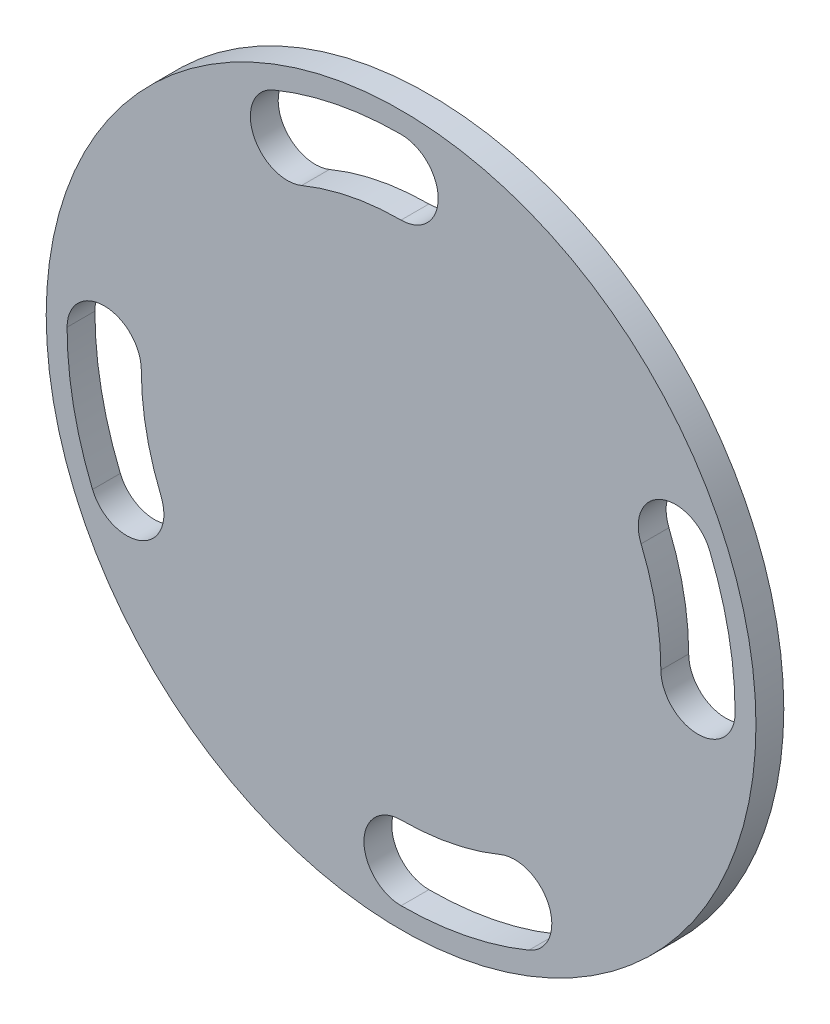
ISO-10303-21;
HEADER;
FILE_DESCRIPTION(('STEP AP214'),'2;1');
FILE_NAME('part.step','',(''),(''),'','','');
FILE_SCHEMA(('AUTOMOTIVE_DESIGN { 1 0 10303 214 1 1 1 1 }'));
ENDSEC;
DATA;
#1=APPLICATION_CONTEXT('core data for automotive mechanical design processes');
#2=APPLICATION_PROTOCOL_DEFINITION('international standard','automotive_design',2000,#1);
#3=PRODUCT_CONTEXT('',#1,'mechanical');
#4=PRODUCT('Part','Part','',(#3));
#5=PRODUCT_RELATED_PRODUCT_CATEGORY('part','',(#4));
#6=PRODUCT_DEFINITION_FORMATION('','',#4);
#7=PRODUCT_DEFINITION_CONTEXT('part definition',#1,'design');
#8=PRODUCT_DEFINITION('design','',#6,#7);
#9=PRODUCT_DEFINITION_SHAPE('','',#8);
#10=(LENGTH_UNIT() NAMED_UNIT(*) SI_UNIT(.MILLI.,.METRE.));
#11=(NAMED_UNIT(*) PLANE_ANGLE_UNIT() SI_UNIT($,.RADIAN.));
#12=(NAMED_UNIT(*) SI_UNIT($,.STERADIAN.) SOLID_ANGLE_UNIT());
#13=UNCERTAINTY_MEASURE_WITH_UNIT(LENGTH_MEASURE(1.E-05),#10,'distance_accuracy_value','');
#14=(GEOMETRIC_REPRESENTATION_CONTEXT(3) GLOBAL_UNCERTAINTY_ASSIGNED_CONTEXT((#13)) GLOBAL_UNIT_ASSIGNED_CONTEXT((#10,
#11,#12)) REPRESENTATION_CONTEXT('',''));
#15=CARTESIAN_POINT('',(0.,0.,0.));
#16=DIRECTION('',(0.,0.,1.));
#17=DIRECTION('',(1.,0.,0.));
#18=AXIS2_PLACEMENT_3D('',#15,#16,#17);
#19=CARTESIAN_POINT('',(0.,0.,0.6));
#20=DIRECTION('',(0.,0.,1.));
#21=DIRECTION('',(1.,0.,0.));
#22=AXIS2_PLACEMENT_3D('',#19,#20,#21);
#23=PLANE('',#22);
#24=CARTESIAN_POINT('',(0.,0.,0.6));
#25=DIRECTION('',(0.,0.,1.));
#26=DIRECTION('',(1.,0.,0.));
#27=AXIS2_PLACEMENT_3D('',#24,#25,#26);
#28=CIRCLE('',#27,7.65);
#29=CARTESIAN_POINT('',(7.65,0.,0.6));
#30=VERTEX_POINT('',#29);
#31=EDGE_CURVE('E11',#30,#30,#28,.T.);
#32=ORIENTED_EDGE('',*,*,#31,.T.);
#33=EDGE_LOOP('',(#32));
#34=FACE_BOUND('',#33,.T.);
#35=CARTESIAN_POINT('',(0.,6.4,0.6));
#36=DIRECTION('',(0.,0.,1.));
#37=DIRECTION('',(1.,0.,0.));
#38=AXIS2_PLACEMENT_3D('',#35,#36,#37);
#39=CIRCLE('',#38,0.800000000000025);
#40=CARTESIAN_POINT('',(0.,5.59999999999997,0.6));
#41=VERTEX_POINT('',#40);
#42=CARTESIAN_POINT('',(0.,7.20000000000064,0.6));
#43=VERTEX_POINT('',#42);
#44=EDGE_CURVE('E249',#41,#43,#39,.T.);
#45=ORIENTED_EDGE('',*,*,#44,.F.);
#46=CARTESIAN_POINT('',(0.,0.,0.6));
#47=DIRECTION('',(0.,0.,-1.));
#48=DIRECTION('',(1.,0.,0.));
#49=AXIS2_PLACEMENT_3D('',#46,#47,#48);
#50=CIRCLE('',#49,5.60000000000057);
#51=CARTESIAN_POINT('',(-2.14302722124451,5.173725382063,0.6));
#52=VERTEX_POINT('',#51);
#53=EDGE_CURVE('E247',#52,#41,#50,.T.);
#54=ORIENTED_EDGE('',*,*,#53,.F.);
#55=CARTESIAN_POINT('',(-2.44917396713655,5.9128290080721,0.6));
#56=DIRECTION('',(0.,0.,1.));
#57=DIRECTION('',(1.,0.,0.));
#58=AXIS2_PLACEMENT_3D('',#55,#56,#57);
#59=CIRCLE('',#58,0.800000000000046);
#60=CARTESIAN_POINT('',(-2.75532071302869,6.65193263408115,0.6));
#61=VERTEX_POINT('',#60);
#62=EDGE_CURVE('E255',#61,#52,#59,.T.);
#63=ORIENTED_EDGE('',*,*,#62,.F.);
#64=CARTESIAN_POINT('',(0.,0.,0.6));
#65=DIRECTION('',(0.,0.,1.));
#66=DIRECTION('',(1.,0.,0.));
#67=AXIS2_PLACEMENT_3D('',#64,#65,#66);
#68=CIRCLE('',#67,7.20000000000064);
#69=EDGE_CURVE('E252',#43,#61,#68,.T.);
#70=ORIENTED_EDGE('',*,*,#69,.F.);
#71=EDGE_LOOP('',(#45,#54,#63,#70));
#72=FACE_BOUND('',#71,.T.);
#73=CARTESIAN_POINT('',(5.91282900807269,2.44917396713695,0.6));
#74=DIRECTION('',(0.,0.,1.));
#75=DIRECTION('',(1.,0.,0.));
#76=AXIS2_PLACEMENT_3D('',#73,#74,#75);
#77=CIRCLE('',#76,0.800000000000009);
#78=CARTESIAN_POINT('',(6.65193263408171,2.75532071302906,0.6));
#79=VERTEX_POINT('',#78);
#80=CARTESIAN_POINT('',(5.17372538206366,2.14302722124487,0.6));
#81=VERTEX_POINT('',#80);
#82=EDGE_CURVE('E218',#79,#81,#77,.T.);
#83=ORIENTED_EDGE('',*,*,#82,.F.);
#84=CARTESIAN_POINT('',(0.,0.,0.6));
#85=DIRECTION('',(0.,0.,1.));
#86=DIRECTION('',(1.,0.,0.));
#87=AXIS2_PLACEMENT_3D('',#84,#85,#86);
#88=CIRCLE('',#87,7.20000000000066);
#89=CARTESIAN_POINT('',(7.20000000000066,3.58609509207387E-13,0.6));
#90=VERTEX_POINT('',#89);
#91=EDGE_CURVE('E216',#90,#79,#88,.T.);
#92=ORIENTED_EDGE('',*,*,#91,.F.);
#93=CARTESIAN_POINT('',(6.40000000000056,3.58609509207387E-13,0.6));
#94=DIRECTION('',(0.,0.,1.));
#95=DIRECTION('',(1.,0.,0.));
#96=AXIS2_PLACEMENT_3D('',#93,#94,#95);
#97=CIRCLE('',#96,0.800000000000101);
#98=CARTESIAN_POINT('',(5.60000000000046,3.13783320556462E-13,0.6));
#99=VERTEX_POINT('',#98);
#100=EDGE_CURVE('E224',#99,#90,#97,.T.);
#101=ORIENTED_EDGE('',*,*,#100,.F.);
#102=CARTESIAN_POINT('',(0.,0.,0.6));
#103=DIRECTION('',(0.,0.,-1.));
#104=DIRECTION('',(1.,0.,0.));
#105=AXIS2_PLACEMENT_3D('',#102,#103,#104);
#106=CIRCLE('',#105,5.60000000000055);
#107=EDGE_CURVE('E221',#81,#99,#106,.T.);
#108=ORIENTED_EDGE('',*,*,#107,.F.);
#109=EDGE_LOOP('',(#83,#92,#101,#108));
#110=FACE_BOUND('',#109,.T.);
#111=CARTESIAN_POINT('',(-5.91282900807169,-2.44917396713714,0.6));
#112=DIRECTION('',(0.,0.,1.));
#113=DIRECTION('',(1.,0.,0.));
#114=AXIS2_PLACEMENT_3D('',#111,#112,#113);
#115=CIRCLE('',#114,0.800000000000163);
#116=CARTESIAN_POINT('',(-6.65193263408079,-2.75532071302948,0.6));
#117=VERTEX_POINT('',#116);
#118=CARTESIAN_POINT('',(-5.17372538206338,-2.14302722124526,0.6));
#119=VERTEX_POINT('',#118);
#120=EDGE_CURVE('E187',#117,#119,#115,.T.);
#121=ORIENTED_EDGE('',*,*,#120,.F.);
#122=CARTESIAN_POINT('',(0.,0.,0.6));
#123=DIRECTION('',(0.,0.,1.));
#124=DIRECTION('',(1.,0.,0.));
#125=AXIS2_PLACEMENT_3D('',#122,#123,#124);
#126=CIRCLE('',#125,7.20000000000072);
#127=CARTESIAN_POINT('',(-7.19999999999976,-6.28046998985927E-13,0.6));
#128=VERTEX_POINT('',#127);
#129=EDGE_CURVE('E185',#128,#117,#126,.T.);
#130=ORIENTED_EDGE('',*,*,#129,.F.);
#131=CARTESIAN_POINT('',(-6.39999999999964,-5.5851178262536E-13,0.6));
#132=DIRECTION('',(0.,0.,1.));
#133=DIRECTION('',(1.,0.,0.));
#134=AXIS2_PLACEMENT_3D('',#131,#132,#133);
#135=CIRCLE('',#134,0.800000000000114);
#136=CARTESIAN_POINT('',(-5.59999999999953,-5.5851178262536E-13,0.6));
#137=VERTEX_POINT('',#136);
#138=EDGE_CURVE('E193',#137,#128,#135,.T.);
#139=ORIENTED_EDGE('',*,*,#138,.F.);
#140=CARTESIAN_POINT('',(0.,0.,0.6));
#141=DIRECTION('',(0.,0.,-1.));
#142=DIRECTION('',(1.,0.,0.));
#143=AXIS2_PLACEMENT_3D('',#140,#141,#142);
#144=CIRCLE('',#143,5.60000000000045);
#145=EDGE_CURVE('E190',#119,#137,#144,.T.);
#146=ORIENTED_EDGE('',*,*,#145,.F.);
#147=EDGE_LOOP('',(#121,#130,#139,#146));
#148=FACE_BOUND('',#147,.T.);
#149=CARTESIAN_POINT('',(9.15962817610477E-13,-6.4000000000002,0.6));
#150=DIRECTION('',(0.,0.,1.));
#151=DIRECTION('',(1.,0.,0.));
#152=AXIS2_PLACEMENT_3D('',#149,#150,#151);
#153=CIRCLE('',#152,0.800000000000045);
#154=CARTESIAN_POINT('',(8.01436787341121E-13,-5.60000000000016,0.6));
#155=VERTEX_POINT('',#154);
#156=CARTESIAN_POINT('',(1.03021324045196E-12,-7.20000000000024,0.6));
#157=VERTEX_POINT('',#156);
#158=EDGE_CURVE('E157',#155,#157,#153,.T.);
#159=ORIENTED_EDGE('',*,*,#158,.F.);
#160=CARTESIAN_POINT('',(0.,0.,0.6));
#161=DIRECTION('',(0.,0.,-1.));
#162=DIRECTION('',(1.,0.,0.));
#163=AXIS2_PLACEMENT_3D('',#160,#161,#162);
#164=CIRCLE('',#163,5.60000000000052);
#165=CARTESIAN_POINT('',(2.14302722124531,-5.17372538206324,0.6));
#166=VERTEX_POINT('',#165);
#167=EDGE_CURVE('E149',#166,#155,#164,.T.);
#168=ORIENTED_EDGE('',*,*,#167,.F.);
#169=CARTESIAN_POINT('',(2.44917396713749,-5.91282900807225,0.6));
#170=DIRECTION('',(0.,0.,1.));
#171=DIRECTION('',(1.,0.,0.));
#172=AXIS2_PLACEMENT_3D('',#169,#170,#171);
#173=CIRCLE('',#172,0.800000000000027);
#174=CARTESIAN_POINT('',(2.75532071302967,-6.65193263408127,0.6));
#175=VERTEX_POINT('',#174);
#176=EDGE_CURVE('E171',#175,#166,#173,.T.);
#177=ORIENTED_EDGE('',*,*,#176,.F.);
#178=CARTESIAN_POINT('',(0.,0.,0.6));
#179=DIRECTION('',(0.,0.,1.));
#180=DIRECTION('',(1.,0.,0.));
#181=AXIS2_PLACEMENT_3D('',#178,#179,#180);
#182=CIRCLE('',#181,7.20000000000059);
#183=EDGE_CURVE('E169',#157,#175,#182,.T.);
#184=ORIENTED_EDGE('',*,*,#183,.F.);
#185=EDGE_LOOP('',(#159,#168,#177,#184));
#186=FACE_BOUND('',#185,.T.);
#187=ADVANCED_FACE('F36',(#34,#72,#110,#148,#186),#23,.T.);
#188=CARTESIAN_POINT('',(0.,0.,0.));
#189=DIRECTION('',(0.,0.,1.));
#190=DIRECTION('',(1.,0.,0.));
#191=AXIS2_PLACEMENT_3D('',#188,#189,#190);
#192=PLANE('',#191);
#193=CARTESIAN_POINT('',(0.,0.,0.));
#194=DIRECTION('',(0.,0.,1.));
#195=DIRECTION('',(1.,0.,0.));
#196=AXIS2_PLACEMENT_3D('',#193,#194,#195);
#197=CIRCLE('',#196,7.20000000000072);
#198=CARTESIAN_POINT('',(-7.19999999999976,-6.28046998985927E-13,0.));
#199=VERTEX_POINT('',#198);
#200=CARTESIAN_POINT('',(-6.65193263408079,-2.75532071302948,0.));
#201=VERTEX_POINT('',#200);
#202=EDGE_CURVE('E165',#199,#201,#197,.T.);
#203=ORIENTED_EDGE('',*,*,#202,.T.);
#204=CARTESIAN_POINT('',(-5.91282900807169,-2.44917396713714,0.));
#205=DIRECTION('',(0.,0.,1.));
#206=DIRECTION('',(1.,0.,0.));
#207=AXIS2_PLACEMENT_3D('',#204,#205,#206);
#208=CIRCLE('',#207,0.800000000000163);
#209=CARTESIAN_POINT('',(-5.17372538206338,-2.14302722124526,0.));
#210=VERTEX_POINT('',#209);
#211=EDGE_CURVE('E198',#201,#210,#208,.T.);
#212=ORIENTED_EDGE('',*,*,#211,.T.);
#213=CARTESIAN_POINT('',(0.,0.,0.));
#214=DIRECTION('',(0.,0.,-1.));
#215=DIRECTION('',(1.,0.,0.));
#216=AXIS2_PLACEMENT_3D('',#213,#214,#215);
#217=CIRCLE('',#216,5.60000000000045);
#218=CARTESIAN_POINT('',(-5.59999999999953,-4.88697809797176E-13,0.));
#219=VERTEX_POINT('',#218);
#220=EDGE_CURVE('E201',#210,#219,#217,.T.);
#221=ORIENTED_EDGE('',*,*,#220,.T.);
#222=CARTESIAN_POINT('',(-6.39999999999964,-5.5851178262536E-13,0.));
#223=DIRECTION('',(0.,0.,1.));
#224=DIRECTION('',(1.,0.,0.));
#225=AXIS2_PLACEMENT_3D('',#222,#223,#224);
#226=CIRCLE('',#225,0.800000000000114);
#227=EDGE_CURVE('E188',#219,#199,#226,.T.);
#228=ORIENTED_EDGE('',*,*,#227,.T.);
#229=EDGE_LOOP('',(#203,#212,#221,#228));
#230=FACE_BOUND('',#229,.T.);
#231=CARTESIAN_POINT('',(0.,0.,0.));
#232=DIRECTION('',(0.,0.,-1.));
#233=DIRECTION('',(1.,0.,0.));
#234=AXIS2_PLACEMENT_3D('',#231,#232,#233);
#235=CIRCLE('',#234,5.60000000000057);
#236=CARTESIAN_POINT('',(-2.14302722124451,5.173725382063,0.));
#237=VERTEX_POINT('',#236);
#238=CARTESIAN_POINT('',(0.,5.59999999999997,0.));
#239=VERTEX_POINT('',#238);
#240=EDGE_CURVE('E246',#237,#239,#235,.T.);
#241=ORIENTED_EDGE('',*,*,#240,.T.);
#242=CARTESIAN_POINT('',(0.,6.4,0.));
#243=DIRECTION('',(0.,0.,1.));
#244=DIRECTION('',(1.,0.,0.));
#245=AXIS2_PLACEMENT_3D('',#242,#243,#244);
#246=CIRCLE('',#245,0.800000000000025);
#247=CARTESIAN_POINT('',(0.,7.20000000000064,0.));
#248=VERTEX_POINT('',#247);
#249=EDGE_CURVE('E260',#239,#248,#246,.T.);
#250=ORIENTED_EDGE('',*,*,#249,.T.);
#251=CARTESIAN_POINT('',(0.,0.,0.));
#252=DIRECTION('',(0.,0.,1.));
#253=DIRECTION('',(1.,0.,0.));
#254=AXIS2_PLACEMENT_3D('',#251,#252,#253);
#255=CIRCLE('',#254,7.20000000000064);
#256=CARTESIAN_POINT('',(-2.75532071302869,6.65193263408115,0.));
#257=VERTEX_POINT('',#256);
#258=EDGE_CURVE('E263',#248,#257,#255,.T.);
#259=ORIENTED_EDGE('',*,*,#258,.T.);
#260=CARTESIAN_POINT('',(-2.44917396713655,5.9128290080721,0.));
#261=DIRECTION('',(0.,0.,1.));
#262=DIRECTION('',(1.,0.,0.));
#263=AXIS2_PLACEMENT_3D('',#260,#261,#262);
#264=CIRCLE('',#263,0.800000000000046);
#265=EDGE_CURVE('E250',#257,#237,#264,.T.);
#266=ORIENTED_EDGE('',*,*,#265,.T.);
#267=EDGE_LOOP('',(#241,#250,#259,#266));
#268=FACE_BOUND('',#267,.T.);
#269=CARTESIAN_POINT('',(0.,0.,0.));
#270=DIRECTION('',(0.,0.,1.));
#271=DIRECTION('',(1.,0.,0.));
#272=AXIS2_PLACEMENT_3D('',#269,#270,#271);
#273=CIRCLE('',#272,7.65);
#274=CARTESIAN_POINT('',(7.65,0.,0.));
#275=VERTEX_POINT('',#274);
#276=EDGE_CURVE('E40',#275,#275,#273,.T.);
#277=ORIENTED_EDGE('',*,*,#276,.F.);
#278=EDGE_LOOP('',(#277));
#279=FACE_BOUND('',#278,.T.);
#280=CARTESIAN_POINT('',(0.,0.,0.));
#281=DIRECTION('',(0.,0.,1.));
#282=DIRECTION('',(1.,0.,0.));
#283=AXIS2_PLACEMENT_3D('',#280,#281,#282);
#284=CIRCLE('',#283,7.20000000000066);
#285=CARTESIAN_POINT('',(7.20000000000066,3.58609509207387E-13,0.));
#286=VERTEX_POINT('',#285);
#287=CARTESIAN_POINT('',(6.65193263408171,2.75532071302906,0.));
#288=VERTEX_POINT('',#287);
#289=EDGE_CURVE('E215',#286,#288,#284,.T.);
#290=ORIENTED_EDGE('',*,*,#289,.T.);
#291=CARTESIAN_POINT('',(5.91282900807269,2.44917396713695,0.));
#292=DIRECTION('',(0.,0.,1.));
#293=DIRECTION('',(1.,0.,0.));
#294=AXIS2_PLACEMENT_3D('',#291,#292,#293);
#295=CIRCLE('',#294,0.800000000000009);
#296=CARTESIAN_POINT('',(5.17372538206366,2.14302722124487,0.));
#297=VERTEX_POINT('',#296);
#298=EDGE_CURVE('E229',#288,#297,#295,.T.);
#299=ORIENTED_EDGE('',*,*,#298,.T.);
#300=CARTESIAN_POINT('',(0.,0.,0.));
#301=DIRECTION('',(0.,0.,-1.));
#302=DIRECTION('',(1.,0.,0.));
#303=AXIS2_PLACEMENT_3D('',#300,#301,#302);
#304=CIRCLE('',#303,5.60000000000055);
#305=CARTESIAN_POINT('',(5.60000000000055,3.13783320556467E-13,0.));
#306=VERTEX_POINT('',#305);
#307=EDGE_CURVE('E232',#297,#306,#304,.T.);
#308=ORIENTED_EDGE('',*,*,#307,.T.);
#309=CARTESIAN_POINT('',(6.40000000000056,3.58609509207387E-13,0.));
#310=DIRECTION('',(0.,0.,1.));
#311=DIRECTION('',(1.,0.,0.));
#312=AXIS2_PLACEMENT_3D('',#309,#310,#311);
#313=CIRCLE('',#312,0.800000000000101);
#314=EDGE_CURVE('E219',#306,#286,#313,.T.);
#315=ORIENTED_EDGE('',*,*,#314,.T.);
#316=EDGE_LOOP('',(#290,#299,#308,#315));
#317=FACE_BOUND('',#316,.T.);
#318=CARTESIAN_POINT('',(0.,0.,0.));
#319=DIRECTION('',(0.,0.,-1.));
#320=DIRECTION('',(1.,0.,0.));
#321=AXIS2_PLACEMENT_3D('',#318,#319,#320);
#322=CIRCLE('',#321,5.60000000000052);
#323=CARTESIAN_POINT('',(2.14302722124531,-5.17372538206324,0.));
#324=VERTEX_POINT('',#323);
#325=CARTESIAN_POINT('',(8.01436787341121E-13,-5.60000000000016,0.));
#326=VERTEX_POINT('',#325);
#327=EDGE_CURVE('E59',#324,#326,#322,.T.);
#328=ORIENTED_EDGE('',*,*,#327,.T.);
#329=CARTESIAN_POINT('',(9.15962817610477E-13,-6.4000000000002,0.));
#330=DIRECTION('',(0.,0.,1.));
#331=DIRECTION('',(1.,0.,0.));
#332=AXIS2_PLACEMENT_3D('',#329,#330,#331);
#333=CIRCLE('',#332,0.800000000000045);
#334=CARTESIAN_POINT('',(1.03021324045196E-12,-7.20000000000024,0.));
#335=VERTEX_POINT('',#334);
#336=EDGE_CURVE('E164',#326,#335,#333,.T.);
#337=ORIENTED_EDGE('',*,*,#336,.T.);
#338=CARTESIAN_POINT('',(0.,0.,0.));
#339=DIRECTION('',(0.,0.,1.));
#340=DIRECTION('',(1.,0.,0.));
#341=AXIS2_PLACEMENT_3D('',#338,#339,#340);
#342=CIRCLE('',#341,7.20000000000059);
#343=CARTESIAN_POINT('',(2.75532071302975,-6.65193263408145,0.));
#344=VERTEX_POINT('',#343);
#345=EDGE_CURVE('E177',#335,#344,#342,.T.);
#346=ORIENTED_EDGE('',*,*,#345,.T.);
#347=CARTESIAN_POINT('',(2.44917396713749,-5.91282900807225,0.));
#348=DIRECTION('',(0.,0.,1.));
#349=DIRECTION('',(1.,0.,0.));
#350=AXIS2_PLACEMENT_3D('',#347,#348,#349);
#351=CIRCLE('',#350,0.800000000000027);
#352=EDGE_CURVE('E158',#344,#324,#351,.T.);
#353=ORIENTED_EDGE('',*,*,#352,.T.);
#354=EDGE_LOOP('',(#328,#337,#346,#353));
#355=FACE_BOUND('',#354,.T.);
#356=ADVANCED_FACE('F282',(#230,#268,#279,#317,#355),#192,.F.);
#357=CARTESIAN_POINT('',(0.,0.,0.6));
#358=DIRECTION('',(0.,0.,-1.));
#359=DIRECTION('',(-1.,0.,0.));
#360=AXIS2_PLACEMENT_3D('',#357,#358,#359);
#361=CYLINDRICAL_SURFACE('',#360,7.65);
#362=ORIENTED_EDGE('',*,*,#31,.F.);
#363=EDGE_LOOP('',(#362));
#364=FACE_BOUND('',#363,.T.);
#365=ORIENTED_EDGE('',*,*,#276,.T.);
#366=EDGE_LOOP('',(#365));
#367=FACE_BOUND('',#366,.T.);
#368=ADVANCED_FACE('F38',(#364,#367),#361,.T.);
#369=CARTESIAN_POINT('',(0.,0.,0.6));
#370=DIRECTION('',(0.,0.,-1.));
#371=DIRECTION('',(-1.,0.,0.));
#372=AXIS2_PLACEMENT_3D('',#369,#370,#371);
#373=CYLINDRICAL_SURFACE('',#372,5.60000000000057);
#374=ORIENTED_EDGE('',*,*,#240,.F.);
#375=DIRECTION('',(0.,0.,-1.));
#376=VECTOR('',#375,1.);
#377=CARTESIAN_POINT('',(-2.14302722124451,5.173725382063,0.6));
#378=LINE('',#377,#376);
#379=EDGE_CURVE('E257',#52,#237,#378,.T.);
#380=ORIENTED_EDGE('',*,*,#379,.F.);
#381=ORIENTED_EDGE('',*,*,#53,.T.);
#382=DIRECTION('',(0.,0.,-1.));
#383=VECTOR('',#382,1.);
#384=CARTESIAN_POINT('',(0.,5.59999999999997,0.6));
#385=LINE('',#384,#383);
#386=EDGE_CURVE('E274',#41,#239,#385,.T.);
#387=ORIENTED_EDGE('',*,*,#386,.T.);
#388=EDGE_LOOP('',(#374,#380,#381,#387));
#389=FACE_BOUND('',#388,.T.);
#390=ADVANCED_FACE('F304',(#389),#373,.T.);
#391=CARTESIAN_POINT('',(0.,6.4,0.6));
#392=DIRECTION('',(0.,0.,-1.));
#393=DIRECTION('',(-1.,0.,0.));
#394=AXIS2_PLACEMENT_3D('',#391,#392,#393);
#395=CYLINDRICAL_SURFACE('',#394,0.800000000000025);
#396=ORIENTED_EDGE('',*,*,#249,.F.);
#397=ORIENTED_EDGE('',*,*,#386,.F.);
#398=ORIENTED_EDGE('',*,*,#44,.T.);
#399=DIRECTION('',(0.,0.,-1.));
#400=VECTOR('',#399,1.);
#401=CARTESIAN_POINT('',(0.,7.20000000000064,0.6));
#402=LINE('',#401,#400);
#403=EDGE_CURVE('E272',#43,#248,#402,.T.);
#404=ORIENTED_EDGE('',*,*,#403,.T.);
#405=EDGE_LOOP('',(#396,#397,#398,#404));
#406=FACE_BOUND('',#405,.T.);
#407=ADVANCED_FACE('F307',(#406),#395,.F.);
#408=CARTESIAN_POINT('',(0.,0.,0.6));
#409=DIRECTION('',(0.,0.,-1.));
#410=DIRECTION('',(-1.,0.,0.));
#411=AXIS2_PLACEMENT_3D('',#408,#409,#410);
#412=CYLINDRICAL_SURFACE('',#411,7.20000000000064);
#413=ORIENTED_EDGE('',*,*,#258,.F.);
#414=ORIENTED_EDGE('',*,*,#403,.F.);
#415=ORIENTED_EDGE('',*,*,#69,.T.);
#416=DIRECTION('',(0.,0.,-1.));
#417=VECTOR('',#416,1.);
#418=CARTESIAN_POINT('',(-2.75532071302869,6.65193263408115,0.6));
#419=LINE('',#418,#417);
#420=EDGE_CURVE('E270',#61,#257,#419,.T.);
#421=ORIENTED_EDGE('',*,*,#420,.T.);
#422=EDGE_LOOP('',(#413,#414,#415,#421));
#423=FACE_BOUND('',#422,.T.);
#424=ADVANCED_FACE('F310',(#423),#412,.F.);
#425=CARTESIAN_POINT('',(-2.44917396713655,5.9128290080721,0.6));
#426=DIRECTION('',(0.,0.,-1.));
#427=DIRECTION('',(-1.,0.,0.));
#428=AXIS2_PLACEMENT_3D('',#425,#426,#427);
#429=CYLINDRICAL_SURFACE('',#428,0.800000000000046);
#430=ORIENTED_EDGE('',*,*,#265,.F.);
#431=ORIENTED_EDGE('',*,*,#420,.F.);
#432=ORIENTED_EDGE('',*,*,#62,.T.);
#433=ORIENTED_EDGE('',*,*,#379,.T.);
#434=EDGE_LOOP('',(#430,#431,#432,#433));
#435=FACE_BOUND('',#434,.T.);
#436=ADVANCED_FACE('F314',(#435),#429,.F.);
#437=CARTESIAN_POINT('',(0.,0.,0.6));
#438=DIRECTION('',(0.,0.,-1.));
#439=DIRECTION('',(-1.,0.,0.));
#440=AXIS2_PLACEMENT_3D('',#437,#438,#439);
#441=CYLINDRICAL_SURFACE('',#440,7.20000000000066);
#442=ORIENTED_EDGE('',*,*,#289,.F.);
#443=DIRECTION('',(0.,0.,-1.));
#444=VECTOR('',#443,1.);
#445=CARTESIAN_POINT('',(7.20000000000066,3.58609509207387E-13,0.6));
#446=LINE('',#445,#444);
#447=EDGE_CURVE('E226',#90,#286,#446,.T.);
#448=ORIENTED_EDGE('',*,*,#447,.F.);
#449=ORIENTED_EDGE('',*,*,#91,.T.);
#450=DIRECTION('',(0.,0.,-1.));
#451=VECTOR('',#450,1.);
#452=CARTESIAN_POINT('',(6.65193263408171,2.75532071302906,0.6));
#453=LINE('',#452,#451);
#454=EDGE_CURVE('E243',#79,#288,#453,.T.);
#455=ORIENTED_EDGE('',*,*,#454,.T.);
#456=EDGE_LOOP('',(#442,#448,#449,#455));
#457=FACE_BOUND('',#456,.T.);
#458=ADVANCED_FACE('F318',(#457),#441,.F.);
#459=CARTESIAN_POINT('',(5.91282900807269,2.44917396713695,0.6));
#460=DIRECTION('',(0.,0.,-1.));
#461=DIRECTION('',(-1.,0.,0.));
#462=AXIS2_PLACEMENT_3D('',#459,#460,#461);
#463=CYLINDRICAL_SURFACE('',#462,0.800000000000009);
#464=ORIENTED_EDGE('',*,*,#298,.F.);
#465=ORIENTED_EDGE('',*,*,#454,.F.);
#466=ORIENTED_EDGE('',*,*,#82,.T.);
#467=DIRECTION('',(0.,0.,-1.));
#468=VECTOR('',#467,1.);
#469=CARTESIAN_POINT('',(5.17372538206366,2.14302722124487,0.6));
#470=LINE('',#469,#468);
#471=EDGE_CURVE('E241',#81,#297,#470,.T.);
#472=ORIENTED_EDGE('',*,*,#471,.T.);
#473=EDGE_LOOP('',(#464,#465,#466,#472));
#474=FACE_BOUND('',#473,.T.);
#475=ADVANCED_FACE('F322',(#474),#463,.F.);
#476=CARTESIAN_POINT('',(0.,0.,0.6));
#477=DIRECTION('',(0.,0.,-1.));
#478=DIRECTION('',(-1.,0.,0.));
#479=AXIS2_PLACEMENT_3D('',#476,#477,#478);
#480=CYLINDRICAL_SURFACE('',#479,5.60000000000055);
#481=ORIENTED_EDGE('',*,*,#307,.F.);
#482=ORIENTED_EDGE('',*,*,#471,.F.);
#483=ORIENTED_EDGE('',*,*,#107,.T.);
#484=DIRECTION('',(0.,0.,-1.));
#485=VECTOR('',#484,1.);
#486=CARTESIAN_POINT('',(5.60000000000055,3.13783320556467E-13,0.6));
#487=LINE('',#486,#485);
#488=EDGE_CURVE('E239',#99,#306,#487,.T.);
#489=ORIENTED_EDGE('',*,*,#488,.T.);
#490=EDGE_LOOP('',(#481,#482,#483,#489));
#491=FACE_BOUND('',#490,.T.);
#492=ADVANCED_FACE('F326',(#491),#480,.T.);
#493=CARTESIAN_POINT('',(6.40000000000056,3.58609509207387E-13,0.6));
#494=DIRECTION('',(0.,0.,-1.));
#495=DIRECTION('',(-1.,0.,0.));
#496=AXIS2_PLACEMENT_3D('',#493,#494,#495);
#497=CYLINDRICAL_SURFACE('',#496,0.800000000000101);
#498=ORIENTED_EDGE('',*,*,#314,.F.);
#499=ORIENTED_EDGE('',*,*,#488,.F.);
#500=ORIENTED_EDGE('',*,*,#100,.T.);
#501=ORIENTED_EDGE('',*,*,#447,.T.);
#502=EDGE_LOOP('',(#498,#499,#500,#501));
#503=FACE_BOUND('',#502,.T.);
#504=ADVANCED_FACE('F330',(#503),#497,.F.);
#505=CARTESIAN_POINT('',(0.,0.,0.6));
#506=DIRECTION('',(0.,0.,-1.));
#507=DIRECTION('',(-1.,0.,0.));
#508=AXIS2_PLACEMENT_3D('',#505,#506,#507);
#509=CYLINDRICAL_SURFACE('',#508,7.20000000000072);
#510=ORIENTED_EDGE('',*,*,#202,.F.);
#511=DIRECTION('',(0.,0.,-1.));
#512=VECTOR('',#511,1.);
#513=CARTESIAN_POINT('',(-7.19999999999976,-6.28046998985927E-13,0.6));
#514=LINE('',#513,#512);
#515=EDGE_CURVE('E195',#128,#199,#514,.T.);
#516=ORIENTED_EDGE('',*,*,#515,.F.);
#517=ORIENTED_EDGE('',*,*,#129,.T.);
#518=DIRECTION('',(0.,0.,-1.));
#519=VECTOR('',#518,1.);
#520=CARTESIAN_POINT('',(-6.65193263408079,-2.75532071302948,0.6));
#521=LINE('',#520,#519);
#522=EDGE_CURVE('E212',#117,#201,#521,.T.);
#523=ORIENTED_EDGE('',*,*,#522,.T.);
#524=EDGE_LOOP('',(#510,#516,#517,#523));
#525=FACE_BOUND('',#524,.T.);
#526=ADVANCED_FACE('F334',(#525),#509,.F.);
#527=CARTESIAN_POINT('',(-5.91282900807169,-2.44917396713714,0.6));
#528=DIRECTION('',(0.,0.,-1.));
#529=DIRECTION('',(-1.,0.,0.));
#530=AXIS2_PLACEMENT_3D('',#527,#528,#529);
#531=CYLINDRICAL_SURFACE('',#530,0.800000000000163);
#532=ORIENTED_EDGE('',*,*,#211,.F.);
#533=ORIENTED_EDGE('',*,*,#522,.F.);
#534=ORIENTED_EDGE('',*,*,#120,.T.);
#535=DIRECTION('',(0.,0.,-1.));
#536=VECTOR('',#535,1.);
#537=CARTESIAN_POINT('',(-5.17372538206338,-2.14302722124526,0.6));
#538=LINE('',#537,#536);
#539=EDGE_CURVE('E210',#119,#210,#538,.T.);
#540=ORIENTED_EDGE('',*,*,#539,.T.);
#541=EDGE_LOOP('',(#532,#533,#534,#540));
#542=FACE_BOUND('',#541,.T.);
#543=ADVANCED_FACE('F338',(#542),#531,.F.);
#544=CARTESIAN_POINT('',(0.,0.,0.6));
#545=DIRECTION('',(0.,0.,-1.));
#546=DIRECTION('',(-1.,0.,0.));
#547=AXIS2_PLACEMENT_3D('',#544,#545,#546);
#548=CYLINDRICAL_SURFACE('',#547,5.60000000000045);
#549=ORIENTED_EDGE('',*,*,#220,.F.);
#550=ORIENTED_EDGE('',*,*,#539,.F.);
#551=ORIENTED_EDGE('',*,*,#145,.T.);
#552=DIRECTION('',(0.,0.,-1.));
#553=VECTOR('',#552,1.);
#554=CARTESIAN_POINT('',(-5.59999999999953,-4.88697809797176E-13,0.6));
#555=LINE('',#554,#553);
#556=EDGE_CURVE('E208',#137,#219,#555,.T.);
#557=ORIENTED_EDGE('',*,*,#556,.T.);
#558=EDGE_LOOP('',(#549,#550,#551,#557));
#559=FACE_BOUND('',#558,.T.);
#560=ADVANCED_FACE('F342',(#559),#548,.T.);
#561=CARTESIAN_POINT('',(-6.39999999999964,-5.5851178262536E-13,0.6));
#562=DIRECTION('',(0.,0.,-1.));
#563=DIRECTION('',(-1.,0.,0.));
#564=AXIS2_PLACEMENT_3D('',#561,#562,#563);
#565=CYLINDRICAL_SURFACE('',#564,0.800000000000114);
#566=ORIENTED_EDGE('',*,*,#227,.F.);
#567=ORIENTED_EDGE('',*,*,#556,.F.);
#568=ORIENTED_EDGE('',*,*,#138,.T.);
#569=ORIENTED_EDGE('',*,*,#515,.T.);
#570=EDGE_LOOP('',(#566,#567,#568,#569));
#571=FACE_BOUND('',#570,.T.);
#572=ADVANCED_FACE('F346',(#571),#565,.F.);
#573=CARTESIAN_POINT('',(0.,0.,0.6));
#574=DIRECTION('',(0.,0.,-1.));
#575=DIRECTION('',(-1.,0.,0.));
#576=AXIS2_PLACEMENT_3D('',#573,#574,#575);
#577=CYLINDRICAL_SURFACE('',#576,5.60000000000052);
#578=ORIENTED_EDGE('',*,*,#327,.F.);
#579=DIRECTION('',(0.,0.,-1.));
#580=VECTOR('',#579,1.);
#581=CARTESIAN_POINT('',(2.14302722124531,-5.17372538206324,0.6));
#582=LINE('',#581,#580);
#583=EDGE_CURVE('E153',#166,#324,#582,.T.);
#584=ORIENTED_EDGE('',*,*,#583,.F.);
#585=ORIENTED_EDGE('',*,*,#167,.T.);
#586=DIRECTION('',(0.,0.,-1.));
#587=VECTOR('',#586,1.);
#588=CARTESIAN_POINT('',(8.01436787341121E-13,-5.60000000000016,0.6));
#589=LINE('',#588,#587);
#590=EDGE_CURVE('E152',#155,#326,#589,.T.);
#591=ORIENTED_EDGE('',*,*,#590,.T.);
#592=EDGE_LOOP('',(#578,#584,#585,#591));
#593=FACE_BOUND('',#592,.T.);
#594=ADVANCED_FACE('F151',(#593),#577,.T.);
#595=CARTESIAN_POINT('',(9.15962817610477E-13,-6.4000000000002,0.6));
#596=DIRECTION('',(0.,0.,-1.));
#597=DIRECTION('',(-1.,0.,0.));
#598=AXIS2_PLACEMENT_3D('',#595,#596,#597);
#599=CYLINDRICAL_SURFACE('',#598,0.800000000000045);
#600=ORIENTED_EDGE('',*,*,#336,.F.);
#601=ORIENTED_EDGE('',*,*,#590,.F.);
#602=ORIENTED_EDGE('',*,*,#158,.T.);
#603=DIRECTION('',(0.,0.,-1.));
#604=VECTOR('',#603,1.);
#605=CARTESIAN_POINT('',(1.03021324045196E-12,-7.20000000000024,0.6));
#606=LINE('',#605,#604);
#607=EDGE_CURVE('E166',#157,#335,#606,.T.);
#608=ORIENTED_EDGE('',*,*,#607,.T.);
#609=EDGE_LOOP('',(#600,#601,#602,#608));
#610=FACE_BOUND('',#609,.T.);
#611=ADVANCED_FACE('F161',(#610),#599,.F.);
#612=CARTESIAN_POINT('',(0.,0.,0.6));
#613=DIRECTION('',(0.,0.,-1.));
#614=DIRECTION('',(-1.,0.,0.));
#615=AXIS2_PLACEMENT_3D('',#612,#613,#614);
#616=CYLINDRICAL_SURFACE('',#615,7.20000000000059);
#617=ORIENTED_EDGE('',*,*,#345,.F.);
#618=ORIENTED_EDGE('',*,*,#607,.F.);
#619=ORIENTED_EDGE('',*,*,#183,.T.);
#620=DIRECTION('',(0.,0.,-1.));
#621=VECTOR('',#620,1.);
#622=CARTESIAN_POINT('',(2.75532071302975,-6.65193263408145,0.6));
#623=LINE('',#622,#621);
#624=EDGE_CURVE('E51',#175,#344,#623,.T.);
#625=ORIENTED_EDGE('',*,*,#624,.T.);
#626=EDGE_LOOP('',(#617,#618,#619,#625));
#627=FACE_BOUND('',#626,.T.);
#628=ADVANCED_FACE('F290',(#627),#616,.F.);
#629=CARTESIAN_POINT('',(2.44917396713749,-5.91282900807225,0.6));
#630=DIRECTION('',(0.,0.,-1.));
#631=DIRECTION('',(-1.,0.,0.));
#632=AXIS2_PLACEMENT_3D('',#629,#630,#631);
#633=CYLINDRICAL_SURFACE('',#632,0.800000000000027);
#634=ORIENTED_EDGE('',*,*,#352,.F.);
#635=ORIENTED_EDGE('',*,*,#624,.F.);
#636=ORIENTED_EDGE('',*,*,#176,.T.);
#637=ORIENTED_EDGE('',*,*,#583,.T.);
#638=EDGE_LOOP('',(#634,#635,#636,#637));
#639=FACE_BOUND('',#638,.T.);
#640=ADVANCED_FACE('F288',(#639),#633,.F.);
#641=CLOSED_SHELL('',(#187,#356,#368,#390,#407,#424,#436,#458,#475,#492,#504,#526,#543,#560,
#572,#594,#611,#628,#640));
#642=MANIFOLD_SOLID_BREP('B2',#641);
#643=ADVANCED_BREP_SHAPE_REPRESENTATION('',(#18,#642),#14);
#644=SHAPE_DEFINITION_REPRESENTATION(#9,#643);
ENDSEC;
END-ISO-10303-21;
